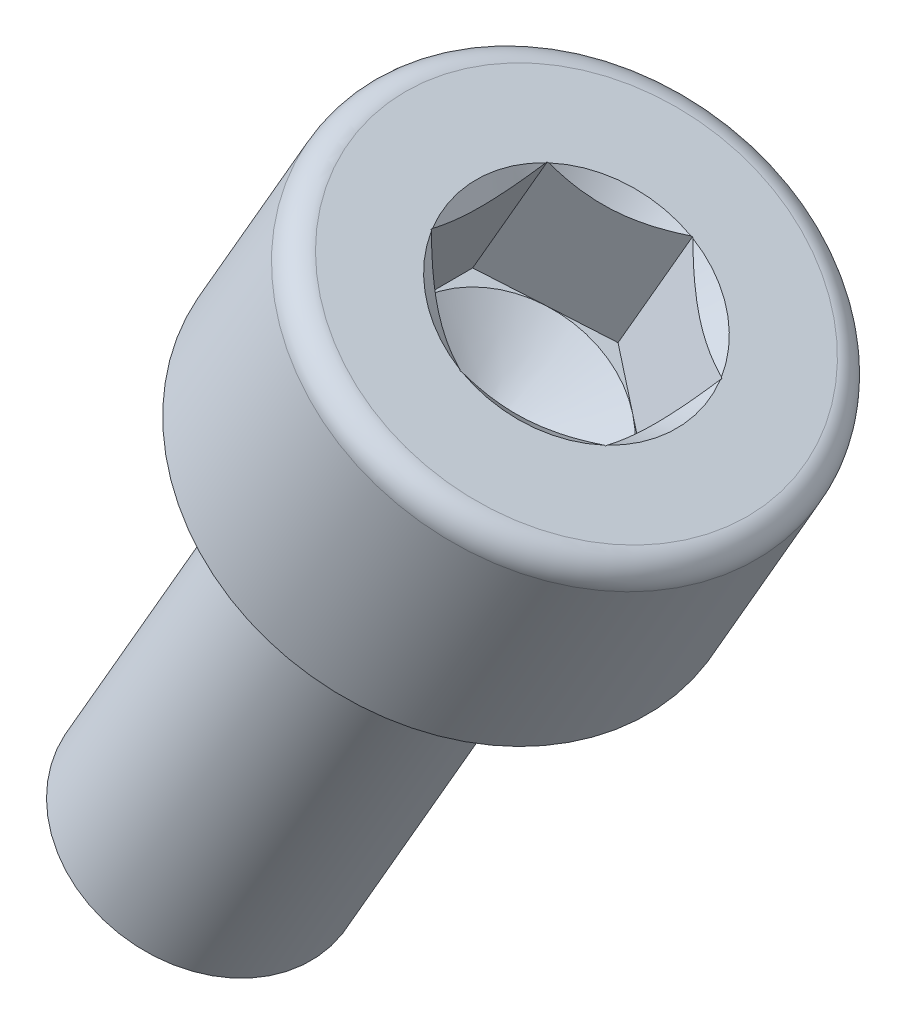
ISO-10303-21;
HEADER;
FILE_DESCRIPTION(('STEP AP214'),'2;1');
FILE_NAME('part.step','',(''),(''),'','','');
FILE_SCHEMA(('AUTOMOTIVE_DESIGN { 1 0 10303 214 1 1 1 1 }'));
ENDSEC;
DATA;
#1=APPLICATION_CONTEXT('core data for automotive mechanical design processes');
#2=APPLICATION_PROTOCOL_DEFINITION('international standard','automotive_design',2000,#1);
#3=PRODUCT_CONTEXT('',#1,'mechanical');
#4=PRODUCT('Part','Part','',(#3));
#5=PRODUCT_RELATED_PRODUCT_CATEGORY('part','',(#4));
#6=PRODUCT_DEFINITION_FORMATION('','',#4);
#7=PRODUCT_DEFINITION_CONTEXT('part definition',#1,'design');
#8=PRODUCT_DEFINITION('design','',#6,#7);
#9=PRODUCT_DEFINITION_SHAPE('','',#8);
#10=(LENGTH_UNIT() NAMED_UNIT(*) SI_UNIT(.MILLI.,.METRE.));
#11=(NAMED_UNIT(*) PLANE_ANGLE_UNIT() SI_UNIT($,.RADIAN.));
#12=(NAMED_UNIT(*) SI_UNIT($,.STERADIAN.) SOLID_ANGLE_UNIT());
#13=UNCERTAINTY_MEASURE_WITH_UNIT(LENGTH_MEASURE(1.E-05),#10,'distance_accuracy_value','');
#14=(GEOMETRIC_REPRESENTATION_CONTEXT(3) GLOBAL_UNCERTAINTY_ASSIGNED_CONTEXT((#13)) GLOBAL_UNIT_ASSIGNED_CONTEXT((#10,
#11,#12)) REPRESENTATION_CONTEXT('',''));
#15=CARTESIAN_POINT('',(0.,0.,0.));
#16=DIRECTION('',(0.,0.,1.));
#17=DIRECTION('',(1.,0.,0.));
#18=AXIS2_PLACEMENT_3D('',#15,#16,#17);
#19=CARTESIAN_POINT('',(231.177788229062,548.1284435325,-362.357299098567));
#20=DIRECTION('',(-0.499999999999997,-0.86602540378444,0.));
#21=DIRECTION('',(0.86602540378444,-0.499999999999997,0.));
#22=AXIS2_PLACEMENT_3D('',#19,#20,#21);
#23=PLANE('',#22);
#24=DIRECTION('',(0.00124392228936698,-0.000718178868616994,0.999998968437693));
#25=VECTOR('',#24,1.);
#26=CARTESIAN_POINT('',(232.259421143508,547.50396247818,-363.08078163776));
#27=LINE('',#26,#25);
#28=CARTESIAN_POINT('',(232.260318867083,547.50344417767,-362.359094545738));
#29=VERTEX_POINT('',#28);
#30=CARTESIAN_POINT('',(232.259421143508,547.50396247818,-363.080781637759));
#31=VERTEX_POINT('',#30);
#32=EDGE_CURVE('E164',#29,#31,#27,.F.);
#33=ORIENTED_EDGE('',*,*,#32,.T.);
#34=DIRECTION('',(-0.750621187472909,0.433371344647004,-0.498755561929496));
#35=VECTOR('',#34,1.);
#36=CARTESIAN_POINT('',(232.259421143508,547.50396247818,-363.080781637759));
#37=LINE('',#36,#35);
#38=CARTESIAN_POINT('',(231.717706962789,547.81672130668,-363.440727459984));
#39=VERTEX_POINT('',#38);
#40=EDGE_CURVE('E160',#31,#39,#37,.T.);
#41=ORIENTED_EDGE('',*,*,#40,.T.);
#42=CARTESIAN_POINT('',(231.177788229441,548.128443533157,-362.357299098567));
#43=DIRECTION('',(0.499999999999986,0.866025403784447,-2.2118650781384E-13));
#44=DIRECTION('',(-0.866025403784447,0.499999999999986,0.));
#45=AXIS2_PLACEMENT_3D('',#42,#43,#44);
#46=CIRCLE('',#45,1.24999999953742);
#47=EDGE_CURVE('E161',#39,#29,#46,.F.);
#48=ORIENTED_EDGE('',*,*,#47,.T.);
#49=EDGE_LOOP('',(#33,#41,#48));
#50=FACE_BOUND('',#49,.T.);
#51=ADVANCED_FACE('F17',(#50),#23,.F.);
#52=CARTESIAN_POINT('',(231.177788229062,548.1284435325,-362.357299098567));
#53=DIRECTION('',(-0.499999999999997,-0.86602540378444,0.));
#54=DIRECTION('',(0.86602540378444,-0.499999999999997,0.));
#55=AXIS2_PLACEMENT_3D('',#52,#53,#54);
#56=PLANE('',#55);
#57=DIRECTION('',(0.749377265183501,-0.432653165778477,-0.501243406508214));
#58=VECTOR('',#57,1.);
#59=CARTESIAN_POINT('',(231.720400133456,547.815166403432,-361.275666184121));
#60=LINE('',#59,#58);
#61=CARTESIAN_POINT('',(231.720400133545,547.815166403819,-361.275666184321));
#62=VERTEX_POINT('',#61);
#63=CARTESIAN_POINT('',(232.261216590679,547.502925876272,-361.637407453717));
#64=VERTEX_POINT('',#63);
#65=EDGE_CURVE('E524',#62,#64,#60,.T.);
#66=ORIENTED_EDGE('',*,*,#65,.T.);
#67=DIRECTION('',(0.00124392228936698,-0.000718178868616994,0.999998968437693));
#68=VECTOR('',#67,1.);
#69=CARTESIAN_POINT('',(232.259421143508,547.50396247818,-363.08078163776));
#70=LINE('',#69,#68);
#71=EDGE_CURVE('E552',#64,#29,#70,.F.);
#72=ORIENTED_EDGE('',*,*,#71,.T.);
#73=CARTESIAN_POINT('',(231.177788229441,548.128443533157,-362.357299098567));
#74=DIRECTION('',(0.499999999999986,0.866025403784447,-2.2118650781384E-13));
#75=DIRECTION('',(-0.866025403784447,0.499999999999986,0.));
#76=AXIS2_PLACEMENT_3D('',#73,#74,#75);
#77=CIRCLE('',#76,1.24999999953749);
#78=EDGE_CURVE('E179',#62,#29,#77,.T.);
#79=ORIENTED_EDGE('',*,*,#78,.F.);
#80=EDGE_LOOP('',(#66,#72,#79));
#81=FACE_BOUND('',#80,.T.);
#82=ADVANCED_FACE('F756',(#81),#56,.F.);
#83=CARTESIAN_POINT('',(232.259421143508,547.50396247818,-363.08078163776));
#84=DIRECTION('',(0.866024510425278,-0.499999484218843,-0.001436357737234));
#85=DIRECTION('',(0.499999999999996,0.866025403784441,0.));
#86=AXIS2_PLACEMENT_3D('',#83,#84,#85);
#87=PLANE('',#86);
#88=DIRECTION('',(0.00124392228936698,-0.000718178868616994,0.999998968437693));
#89=VECTOR('',#88,1.);
#90=CARTESIAN_POINT('',(233.184421143508,549.106109475181,-363.08078163776));
#91=LINE('',#90,#89);
#92=CARTESIAN_POINT('',(233.184421143508,549.106109475181,-363.080781637759));
#93=VERTEX_POINT('',#92);
#94=CARTESIAN_POINT('',(233.184442166602,549.106097337533,-363.063881020436));
#95=VERTEX_POINT('',#94);
#96=EDGE_CURVE('E428',#93,#95,#91,.T.);
#97=ORIENTED_EDGE('',*,*,#96,.F.);
#98=DIRECTION('',(-0.500000000000029,-0.866025403784422,0.));
#99=VECTOR('',#98,1.);
#100=CARTESIAN_POINT('',(233.184421143508,549.106109475181,-363.080781637759));
#101=LINE('',#100,#99);
#102=EDGE_CURVE('E169',#93,#31,#101,.T.);
#103=ORIENTED_EDGE('',*,*,#102,.T.);
#104=ORIENTED_EDGE('',*,*,#32,.F.);
#105=ORIENTED_EDGE('',*,*,#71,.F.);
#106=DIRECTION('',(0.500000000000051,0.866025403784409,0.));
#107=VECTOR('',#106,1.);
#108=CARTESIAN_POINT('',(232.261216590679,547.502925876272,-361.637407453717));
#109=LINE('',#108,#107);
#110=CARTESIAN_POINT('',(233.186216590679,549.105072873273,-361.637407453717));
#111=VERTEX_POINT('',#110);
#112=EDGE_CURVE('E514',#64,#111,#109,.T.);
#113=ORIENTED_EDGE('',*,*,#112,.T.);
#114=DIRECTION('',(0.00124392228936698,-0.000718178868616994,0.999998968437693));
#115=VECTOR('',#114,1.);
#116=CARTESIAN_POINT('',(233.184421143508,549.106109475181,-363.08078163776));
#117=LINE('',#116,#115);
#118=CARTESIAN_POINT('',(233.186195567648,549.105085011029,-361.654308070932));
#119=VERTEX_POINT('',#118);
#120=EDGE_CURVE('E182',#119,#111,#117,.T.);
#121=ORIENTED_EDGE('',*,*,#120,.F.);
#122=CARTESIAN_POINT('',(233.184442166648,549.10609733758,-363.063881020586));
#123=CARTESIAN_POINT('',(233.172644884747,549.085525026057,-363.015557488961));
#124=CARTESIAN_POINT('',(233.161560640962,549.066185453478,-362.966440531832));
#125=CARTESIAN_POINT('',(233.141292004143,549.030791535469,-362.866323081709));
#126=CARTESIAN_POINT('',(233.132119481784,549.014757723132,-362.815313009606));
#127=CARTESIAN_POINT('',(233.116333507926,548.987118516482,-362.711892543585));
#128=CARTESIAN_POINT('',(233.109710481527,548.975496555323,-362.659488195184));
#129=CARTESIAN_POINT('',(233.099567079166,548.957623427783,-362.553581787685));
#130=CARTESIAN_POINT('',(233.096037607527,548.951356517841,-362.50008342311));
#131=CARTESIAN_POINT('',(233.093743757376,548.947187440853,-362.431851194315));
#132=CARTESIAN_POINT('',(233.093381505867,548.946518221717,-362.417307089604));
#133=CARTESIAN_POINT('',(233.092909945372,548.945617860091,-362.388207513258));
#134=CARTESIAN_POINT('',(233.092800521647,548.945386518892,-362.373652049778));
#135=CARTESIAN_POINT('',(233.09286667599,548.945350297496,-362.321156797242));
#136=CARTESIAN_POINT('',(233.093782235586,548.946827068951,-362.283205190168));
#137=CARTESIAN_POINT('',(233.097298138949,548.952699594373,-362.207598115745));
#138=CARTESIAN_POINT('',(233.099899670433,548.957097406181,-362.16994287612));
#139=CARTESIAN_POINT('',(233.110071767781,548.974392964188,-362.057494884762));
#140=CARTESIAN_POINT('',(233.120007848879,548.991390253783,-361.983520459256));
#141=CARTESIAN_POINT('',(233.139785554404,549.025311610405,-361.867033511053));
#142=CARTESIAN_POINT('',(233.1481662412,549.039702200408,-361.823456205357));
#143=CARTESIAN_POINT('',(233.166261186764,549.070797644643,-361.737850585768));
#144=CARTESIAN_POINT('',(233.175963381897,549.087481575075,-361.695812187019));
#145=CARTESIAN_POINT('',(233.186195567657,549.105085011045,-361.654308070895));
#146=B_SPLINE_CURVE_WITH_KNOTS('',3,(#122,#123,#124,#125,#126,#127,#128,#129,#130,#131,#132,
#133,#134,#135,#136,#137,#138,#139,#140,#141,#142,#143,#144,#145),.UNSPECIFIED.,.F.,.F.,(4,2,2,
2,2,2,2,2,2,2,2,4),(0.,0.161592976152803,0.324161275089221,0.486112932364473,0.64758680606129,
0.691272786490334,0.734938937503871,0.848735605559947,0.962612527237212,1.19125625178,
1.3311331060686,1.46980937850131),.UNSPECIFIED.);
#147=EDGE_CURVE('E423',#95,#119,#146,.T.);
#148=ORIENTED_EDGE('',*,*,#147,.F.);
#149=EDGE_LOOP('',(#97,#103,#104,#105,#113,#121,#148));
#150=FACE_BOUND('',#149,.T.);
#151=ADVANCED_FACE('F414',(#150),#87,.F.);
#152=CARTESIAN_POINT('',(231.17599278189,548.129480134408,-363.800673282609));
#153=DIRECTION('',(0.431934986909713,-0.249377780964739,-0.866742689293892));
#154=DIRECTION('',(-0.895019691172818,0.,-0.446026627470731));
#155=AXIS2_PLACEMENT_3D('',#152,#153,#154);
#156=PLANE('',#155);
#157=DIRECTION('',(-0.500000000000051,-0.866025403784409,0.));
#158=VECTOR('',#157,1.);
#159=CARTESIAN_POINT('',(232.10099278189,549.731627131409,-363.800673282609));
#160=LINE('',#159,#158);
#161=CARTESIAN_POINT('',(232.10099278189,549.731627131409,-363.800673282609));
#162=VERTEX_POINT('',#161);
#163=CARTESIAN_POINT('',(231.17599278189,548.129480134408,-363.800673282609));
#164=VERTEX_POINT('',#163);
#165=EDGE_CURVE('E174',#162,#164,#160,.T.);
#166=ORIENTED_EDGE('',*,*,#165,.T.);
#167=DIRECTION('',(0.750621187472946,-0.433371344646999,0.498755561929445));
#168=VECTOR('',#167,1.);
#169=CARTESIAN_POINT('',(231.17599278189,548.129480134408,-363.800673282609));
#170=LINE('',#169,#168);
#171=EDGE_CURVE('E148',#164,#39,#170,.T.);
#172=ORIENTED_EDGE('',*,*,#171,.T.);
#173=ORIENTED_EDGE('',*,*,#40,.F.);
#174=ORIENTED_EDGE('',*,*,#102,.F.);
#175=DIRECTION('',(0.750621187470166,-0.433371344652309,0.498755561929014));
#176=VECTOR('',#175,1.);
#177=CARTESIAN_POINT('',(233.171735169125,549.113433725906,-363.089210923246));
#178=LINE('',#177,#176);
#179=CARTESIAN_POINT('',(233.171735169102,549.113433726019,-363.08921092329));
#180=VERTEX_POINT('',#179);
#181=EDGE_CURVE('E422',#180,#93,#178,.T.);
#182=ORIENTED_EDGE('',*,*,#181,.F.);
#183=CARTESIAN_POINT('',(232.113678756365,549.724302880745,-363.792243997113));
#184=CARTESIAN_POINT('',(232.138094067797,549.682823218711,-363.768142342071));
#185=CARTESIAN_POINT('',(232.163816992992,549.642233017214,-363.743644961242));
#186=CARTESIAN_POINT('',(232.218574174539,549.563522922774,-363.693710774633));
#187=CARTESIAN_POINT('',(232.247627479942,549.525419418489,-363.668269191213));
#188=CARTESIAN_POINT('',(232.309342532022,549.453034973651,-363.61668760536));
#189=CARTESIAN_POINT('',(232.341990173421,549.418740081867,-363.590550618164));
#190=CARTESIAN_POINT('',(232.411210706945,549.355046164583,-363.53772915389));
#191=CARTESIAN_POINT('',(232.447771734797,549.325632993969,-363.511046519477));
#192=CARTESIAN_POINT('',(232.496609618404,549.29194299673,-363.477015280763));
#193=CARTESIAN_POINT('',(232.507146399551,549.284981218155,-363.469761320164));
#194=CARTESIAN_POINT('',(232.528481422489,549.271490819715,-363.455247729635));
#195=CARTESIAN_POINT('',(232.539279543431,549.264962004671,-363.447988103773));
#196=CARTESIAN_POINT('',(232.578684487133,549.242213522655,-363.421805777576));
#197=CARTESIAN_POINT('',(232.608040147589,549.227270394214,-363.402877182951));
#198=CARTESIAN_POINT('',(232.668214332061,549.200431245781,-363.365167695172));
#199=CARTESIAN_POINT('',(232.699033873143,549.188537382154,-363.346386915597));
#200=CARTESIAN_POINT('',(232.793472025654,549.157181910532,-363.290302796619));
#201=CARTESIAN_POINT('',(232.858842916616,549.142173897727,-363.253407602401));
#202=CARTESIAN_POINT('',(232.965913382862,549.125696755447,-363.195309029162));
#203=CARTESIAN_POINT('',(233.006949945511,549.121233466736,-363.173574583152));
#204=CARTESIAN_POINT('',(233.089195862343,549.115291330441,-363.130878260205));
#205=CARTESIAN_POINT('',(233.130400710261,549.113787195809,-363.109911353385));
#206=CARTESIAN_POINT('',(233.171735169141,549.113433726021,-363.089210923271));
#207=B_SPLINE_CURVE_WITH_KNOTS('',3,(#183,#184,#185,#186,#187,#188,#189,#190,#191,#192,#193,
#194,#195,#196,#197,#198,#199,#200,#201,#202,#203,#204,#205,#206),.UNSPECIFIED.,.F.,.F.,(4,2,2,
2,2,2,2,2,2,2,2,4),(0.,0.161592976156838,0.324161275095929,0.486112932367295,0.64758680606111,
0.691272786490041,0.734938937503583,0.848735605560681,0.962612527237655,1.19125625177881,
1.33113310606732,1.4698093785017),.UNSPECIFIED.);
#208=CARTESIAN_POINT('',(232.113678756437,549.72430288063,-363.792243997024));
#209=VERTEX_POINT('',#208);
#210=EDGE_CURVE('E417',#209,#180,#207,.T.);
#211=ORIENTED_EDGE('',*,*,#210,.F.);
#212=DIRECTION('',(0.750621187474568,-0.433371344642524,0.498755561930892));
#213=VECTOR('',#212,1.);
#214=CARTESIAN_POINT('',(232.10099278189,549.731627131409,-363.800673282609));
#215=LINE('',#214,#213);
#216=EDGE_CURVE('E168',#162,#209,#215,.T.);
#217=ORIENTED_EDGE('',*,*,#216,.F.);
#218=EDGE_LOOP('',(#166,#172,#173,#174,#182,#211,#217));
#219=FACE_BOUND('',#218,.T.);
#220=ADVANCED_FACE('F171',(#219),#156,.F.);
#221=CARTESIAN_POINT('',(231.177788229062,548.1284435325,-362.357299098567));
#222=DIRECTION('',(-0.499999999999997,-0.86602540378444,0.));
#223=DIRECTION('',(0.86602540378444,-0.499999999999997,0.));
#224=AXIS2_PLACEMENT_3D('',#221,#222,#223);
#225=PLANE('',#224);
#226=ORIENTED_EDGE('',*,*,#171,.F.);
#227=DIRECTION('',(-0.749377265183696,0.432653165778134,0.501243406508218));
#228=VECTOR('',#227,1.);
#229=CARTESIAN_POINT('',(231.17599278189,548.129480134408,-363.800673282609));
#230=LINE('',#229,#228);
#231=CARTESIAN_POINT('',(230.635176324958,548.441720661838,-363.438932012813));
#232=VERTEX_POINT('',#231);
#233=EDGE_CURVE('E150',#164,#232,#230,.T.);
#234=ORIENTED_EDGE('',*,*,#233,.T.);
#235=CARTESIAN_POINT('',(231.177788229441,548.128443533157,-362.357299098567));
#236=DIRECTION('',(0.499999999999986,0.866025403784447,-2.2118650781384E-13));
#237=DIRECTION('',(-0.866025403784447,0.499999999999986,0.));
#238=AXIS2_PLACEMENT_3D('',#235,#236,#237);
#239=CIRCLE('',#238,1.24999999953734);
#240=EDGE_CURVE('E144',#232,#39,#239,.F.);
#241=ORIENTED_EDGE('',*,*,#240,.T.);
#242=EDGE_LOOP('',(#226,#234,#241));
#243=FACE_BOUND('',#242,.T.);
#244=ADVANCED_FACE('F146',(#243),#225,.F.);
#245=CARTESIAN_POINT('',(231.177788229408,548.1284435331,-362.357299098567));
#246=DIRECTION('',(0.499999999999986,0.866025403784447,-2.2118650781384E-13));
#247=DIRECTION('',(-0.866025403784447,0.499999999999986,0.));
#248=AXIS2_PLACEMENT_3D('',#245,#246,#247);
#249=CONICAL_SURFACE('',#248,1.24999999942379,1.04719754990414);
#250=CARTESIAN_POINT('',(231.177788229441,548.128443533157,-362.357299098567));
#251=DIRECTION('',(0.499999999999986,0.866025403784447,-2.2118650781384E-13));
#252=DIRECTION('',(-0.866025403784447,0.499999999999986,0.));
#253=AXIS2_PLACEMENT_3D('',#250,#251,#252);
#254=CIRCLE('',#253,1.24999999953747);
#255=CARTESIAN_POINT('',(230.637869495715,548.440165758977,-361.27387073715));
#256=VERTEX_POINT('',#255);
#257=EDGE_CURVE('E155',#256,#62,#254,.T.);
#258=ORIENTED_EDGE('',*,*,#257,.T.);
#259=ORIENTED_EDGE('',*,*,#78,.T.);
#260=ORIENTED_EDGE('',*,*,#47,.F.);
#261=ORIENTED_EDGE('',*,*,#240,.F.);
#262=CARTESIAN_POINT('',(231.177788229441,548.128443533157,-362.357299098567));
#263=DIRECTION('',(0.499999999999986,0.866025403784447,-2.2118650781384E-13));
#264=DIRECTION('',(-0.866025403784447,0.499999999999986,0.));
#265=AXIS2_PLACEMENT_3D('',#262,#263,#264);
#266=CIRCLE('',#265,1.24999999953734);
#267=CARTESIAN_POINT('',(230.09525759142,548.753442887986,-362.355503651395));
#268=VERTEX_POINT('',#267);
#269=EDGE_CURVE('E382',#232,#268,#266,.T.);
#270=ORIENTED_EDGE('',*,*,#269,.T.);
#271=CARTESIAN_POINT('',(231.177788229441,548.128443533157,-362.357299098567));
#272=DIRECTION('',(0.499999999999986,0.866025403784447,-2.2118650781384E-13));
#273=DIRECTION('',(-0.866025403784447,0.499999999999986,0.));
#274=AXIS2_PLACEMENT_3D('',#271,#272,#273);
#275=CIRCLE('',#274,1.24999999953743);
#276=EDGE_CURVE('E793',#268,#256,#275,.T.);
#277=ORIENTED_EDGE('',*,*,#276,.T.);
#278=EDGE_LOOP('',(#258,#259,#260,#261,#270,#277));
#279=FACE_BOUND('',#278,.T.);
#280=CARTESIAN_POINT('',(230.816944310303,547.503443531604,-362.357299098595));
#281=VERTEX_POINT('',#280);
#282=VERTEX_LOOP('',#281);
#283=FACE_BOUND('',#282,.T.);
#284=ADVANCED_FACE('F176',(#279,#283),#249,.F.);
#285=CARTESIAN_POINT('',(231.177788229062,548.1284435325,-362.357299098567));
#286=DIRECTION('',(-0.499999999999997,-0.86602540378444,0.));
#287=DIRECTION('',(0.86602540378444,-0.499999999999997,0.));
#288=AXIS2_PLACEMENT_3D('',#285,#286,#287);
#289=PLANE('',#288);
#290=DIRECTION('',(0.750621187472557,-0.43337134464762,0.49875556192949));
#291=VECTOR('',#290,1.);
#292=CARTESIAN_POINT('',(230.637869495425,548.440165758706,-361.273870736949));
#293=LINE('',#292,#291);
#294=CARTESIAN_POINT('',(231.179583676233,548.127406930592,-360.913924914525));
#295=VERTEX_POINT('',#294);
#296=EDGE_CURVE('E509',#256,#295,#293,.T.);
#297=ORIENTED_EDGE('',*,*,#296,.T.);
#298=DIRECTION('',(0.749377265183496,-0.432653165778519,-0.501243406508185));
#299=VECTOR('',#298,1.);
#300=CARTESIAN_POINT('',(231.179583676233,548.127406930592,-360.913924914524));
#301=LINE('',#300,#299);
#302=EDGE_CURVE('E519',#295,#62,#301,.T.);
#303=ORIENTED_EDGE('',*,*,#302,.T.);
#304=ORIENTED_EDGE('',*,*,#257,.F.);
#305=EDGE_LOOP('',(#297,#303,#304));
#306=FACE_BOUND('',#305,.T.);
#307=ADVANCED_FACE('F402',(#306),#289,.F.);
#308=CARTESIAN_POINT('',(232.261216590679,547.502925876272,-361.637407453717));
#309=DIRECTION('',(0.434089523515564,-0.250621703254105,0.865306331556659));
#310=DIRECTION('',(0.893832919324574,0.,-0.448400169861376));
#311=AXIS2_PLACEMENT_3D('',#308,#309,#310);
#312=PLANE('',#311);
#313=ORIENTED_EDGE('',*,*,#112,.F.);
#314=ORIENTED_EDGE('',*,*,#65,.F.);
#315=ORIENTED_EDGE('',*,*,#302,.F.);
#316=DIRECTION('',(0.50000000000004,0.866025403784416,0.));
#317=VECTOR('',#316,1.);
#318=CARTESIAN_POINT('',(231.179583676233,548.127406930592,-360.913924914525));
#319=LINE('',#318,#317);
#320=CARTESIAN_POINT('',(232.104583676233,549.729553927593,-360.913924914525));
#321=VERTEX_POINT('',#320);
#322=EDGE_CURVE('E505',#295,#321,#319,.T.);
#323=ORIENTED_EDGE('',*,*,#322,.T.);
#324=DIRECTION('',(-0.749377265193565,0.43265316576259,0.501243406506881));
#325=VECTOR('',#324,1.);
#326=CARTESIAN_POINT('',(232.11724862754,549.722241814547,-360.922396246164));
#327=LINE('',#326,#325);
#328=CARTESIAN_POINT('',(232.117248627633,549.722241814596,-360.922396246208));
#329=VERTEX_POINT('',#328);
#330=EDGE_CURVE('E517',#329,#321,#327,.T.);
#331=ORIENTED_EDGE('',*,*,#330,.F.);
#332=CARTESIAN_POINT('',(233.173551639394,549.112384986422,-361.628936122039));
#333=CARTESIAN_POINT('',(233.125481653387,549.112754730377,-361.604714245456));
#334=CARTESIAN_POINT('',(233.077529142885,549.114701061512,-361.580094669153));
#335=CARTESIAN_POINT('',(232.982110149246,549.122695222242,-361.529911405638));
#336=CARTESIAN_POINT('',(232.934648346492,549.128767736248,-361.504342916954));
#337=CARTESIAN_POINT('',(232.841232699542,549.145948042256,-361.452504036787));
#338=CARTESIAN_POINT('',(232.795273818342,549.157036647455,-361.426236675582));
#339=CARTESIAN_POINT('',(232.705634740619,549.185060369486,-361.373151732359));
#340=CARTESIAN_POINT('',(232.66194822161,549.201978141655,-361.346336002197));
#341=CARTESIAN_POINT('',(232.608437762026,549.227378987908,-361.312135012118));
#342=CARTESIAN_POINT('',(232.597158386108,549.233012773487,-361.304844868007));
#343=CARTESIAN_POINT('',(232.574844044527,549.244723347403,-361.29025888219));
#344=CARTESIAN_POINT('',(232.563808970249,549.250799933496,-361.282963044572));
#345=CARTESIAN_POINT('',(232.524471035146,549.273513673755,-361.256650118232));
#346=CARTESIAN_POINT('',(232.496899284989,549.291437601156,-361.237627105782));
#347=CARTESIAN_POINT('',(232.443662857826,549.330076099879,-361.199729519138));
#348=CARTESIAN_POINT('',(232.417999539472,549.350792630352,-361.180855059089));
#349=CARTESIAN_POINT('',(232.343765704946,549.41681997585,-361.124491186708));
#350=CARTESIAN_POINT('',(232.29817495765,549.465875694764,-361.087411955421));
#351=CARTESIAN_POINT('',(232.230515001593,549.550279208836,-361.029023580458));
#352=CARTESIAN_POINT('',(232.206185605698,549.583554973886,-361.007180720772));
#353=CARTESIAN_POINT('',(232.160023093145,549.651749478862,-360.96427142413));
#354=CARTESIAN_POINT('',(232.13817034294,549.686651665481,-360.9431999322));
#355=CARTESIAN_POINT('',(232.117248627632,549.722241814618,-360.922396246189));
#356=B_SPLINE_CURVE_WITH_KNOTS('',3,(#332,#333,#334,#335,#336,#337,#338,#339,#340,#341,#342,
#343,#344,#345,#346,#347,#348,#349,#350,#351,#352,#353,#354,#355),.UNSPECIFIED.,.F.,.F.,(4,2,2,
2,2,2,2,2,2,2,2,4),(0.,0.161592976156798,0.324161275095758,0.486112932367122,0.647586806060747,
0.691272786489624,0.734938937503271,0.848735605560365,0.96261252723748,1.19125625177868,
1.33113310606679,1.46980937850078),.UNSPECIFIED.);
#357=CARTESIAN_POINT('',(233.173551639272,549.112384986378,-361.628936122011));
#358=VERTEX_POINT('',#357);
#359=EDGE_CURVE('E383',#358,#329,#356,.T.);
#360=ORIENTED_EDGE('',*,*,#359,.F.);
#361=DIRECTION('',(-0.749377265154543,0.432653165828576,0.501243406508264));
#362=VECTOR('',#361,1.);
#363=CARTESIAN_POINT('',(233.186216590679,549.105072873273,-361.637407453717));
#364=LINE('',#363,#362);
#365=EDGE_CURVE('E381',#111,#358,#364,.T.);
#366=ORIENTED_EDGE('',*,*,#365,.F.);
#367=EDGE_LOOP('',(#313,#314,#315,#323,#331,#360,#366));
#368=FACE_BOUND('',#367,.T.);
#369=ADVANCED_FACE('F396',(#368),#312,.F.);
#370=CARTESIAN_POINT('',(230.094359867445,548.753961188727,-363.077190743417));
#371=DIRECTION('',(-0.434089523515564,0.250621703254105,-0.865306331556659));
#372=DIRECTION('',(-0.893832919324574,0.,0.448400169861376));
#373=AXIS2_PLACEMENT_3D('',#370,#371,#372);
#374=PLANE('',#373);
#375=DIRECTION('',(-0.499999999999996,-0.866025403784441,0.));
#376=VECTOR('',#375,1.);
#377=CARTESIAN_POINT('',(230.094359867444,548.753961188727,-363.077190743417));
#378=LINE('',#377,#376);
#379=CARTESIAN_POINT('',(231.019359867444,550.356108185728,-363.077190743417));
#380=VERTEX_POINT('',#379);
#381=CARTESIAN_POINT('',(230.094359867445,548.753961188727,-363.077190743417));
#382=VERTEX_POINT('',#381);
#383=EDGE_CURVE('E802',#380,#382,#378,.T.);
#384=ORIENTED_EDGE('',*,*,#383,.T.);
#385=DIRECTION('',(0.749377265183792,-0.43265316577849,-0.501243406507767));
#386=VECTOR('',#385,1.);
#387=CARTESIAN_POINT('',(230.094359867445,548.753961188727,-363.077190743417));
#388=LINE('',#387,#386);
#389=EDGE_CURVE('E823',#382,#232,#388,.T.);
#390=ORIENTED_EDGE('',*,*,#389,.T.);
#391=ORIENTED_EDGE('',*,*,#233,.F.);
#392=ORIENTED_EDGE('',*,*,#165,.F.);
#393=DIRECTION('',(0.749377265177957,-0.432653165787645,-0.50124340650859));
#394=VECTOR('',#393,1.);
#395=CARTESIAN_POINT('',(232.088327830584,549.738939244455,-363.79220195097));
#396=LINE('',#395,#394);
#397=CARTESIAN_POINT('',(232.088327830544,549.73893924458,-363.792201950926));
#398=VERTEX_POINT('',#397);
#399=EDGE_CURVE('E380',#398,#162,#396,.T.);
#400=ORIENTED_EDGE('',*,*,#399,.F.);
#401=CARTESIAN_POINT('',(231.032024818829,550.348796072752,-363.085662075095));
#402=CARTESIAN_POINT('',(231.056380019491,550.307351115688,-363.109883951678));
#403=CARTESIAN_POINT('',(231.082041846948,550.266796188985,-363.134503527981));
#404=CARTESIAN_POINT('',(231.136674490042,550.188157996855,-363.184686791496));
#405=CARTESIAN_POINT('',(231.165664342813,550.150091126964,-363.21025528018));
#406=CARTESIAN_POINT('',(231.227250747736,550.077780956597,-363.262094160347));
#407=CARTESIAN_POINT('',(231.259833202131,550.043523700548,-363.288361521552));
#408=CARTESIAN_POINT('',(231.32892199618,549.979905843085,-363.341446464775));
#409=CARTESIAN_POINT('',(231.365416476158,549.950531093904,-363.368262194937));
#410=CARTESIAN_POINT('',(231.414169484082,549.916890099663,-363.402463185016));
#411=CARTESIAN_POINT('',(231.424688173473,549.909938766368,-363.409753329127));
#412=CARTESIAN_POINT('',(231.445986998767,549.896469266649,-363.424339314944));
#413=CARTESIAN_POINT('',(231.456767013831,549.889950905038,-363.431635152562));
#414=CARTESIAN_POINT('',(231.496106657461,549.867240124035,-363.457948078902));
#415=CARTESIAN_POINT('',(231.525415109004,549.852324251673,-363.476971091352));
#416=CARTESIAN_POINT('',(231.585495244044,549.825539402705,-363.514868677996));
#417=CARTESIAN_POINT('',(231.616267944889,549.813672582301,-363.533743138045));
#418=CARTESIAN_POINT('',(231.710566220698,549.782397868531,-363.590107010426));
#419=CARTESIAN_POINT('',(231.775845093126,549.767442982652,-363.627186241713));
#420=CARTESIAN_POINT('',(231.88277065851,549.751049498923,-363.685574616676));
#421=CARTESIAN_POINT('',(231.923753014322,549.746617506544,-363.707417476362));
#422=CARTESIAN_POINT('',(232.005892444306,549.740736850459,-363.750326773004));
#423=CARTESIAN_POINT('',(232.047044999669,549.739262906948,-363.771398264934));
#424=CARTESIAN_POINT('',(232.0883278306,549.73893924457,-363.792201950945));
#425=B_SPLINE_CURVE_WITH_KNOTS('',3,(#401,#402,#403,#404,#405,#406,#407,#408,#409,#410,#411,
#412,#413,#414,#415,#416,#417,#418,#419,#420,#421,#422,#423,#424),.UNSPECIFIED.,.F.,.F.,(4,2,2,
2,2,2,2,2,2,2,2,4),(0.,0.161592976156892,0.324161275095849,0.486112932367277,0.647586806061016,
0.691272786489565,0.73493893750287,0.848735605559928,0.962612527236987,1.19125625177819,
1.33113310606675,1.46980937850102),.UNSPECIFIED.);
#426=CARTESIAN_POINT('',(231.032024818852,550.348796072624,-363.085662075123));
#427=VERTEX_POINT('',#426);
#428=EDGE_CURVE('E372',#427,#398,#425,.T.);
#429=ORIENTED_EDGE('',*,*,#428,.F.);
#430=DIRECTION('',(0.749377265196929,-0.432653165757963,-0.501243406505846));
#431=VECTOR('',#430,1.);
#432=CARTESIAN_POINT('',(231.019359867444,550.356108185728,-363.077190743417));
#433=LINE('',#432,#431);
#434=EDGE_CURVE('E496',#380,#427,#433,.T.);
#435=ORIENTED_EDGE('',*,*,#434,.F.);
#436=EDGE_LOOP('',(#384,#390,#391,#392,#400,#429,#435));
#437=FACE_BOUND('',#436,.T.);
#438=ADVANCED_FACE('F391',(#437),#374,.F.);
#439=CARTESIAN_POINT('',(231.177788229062,548.1284435325,-362.357299098567));
#440=DIRECTION('',(-0.499999999999997,-0.86602540378444,0.));
#441=DIRECTION('',(0.86602540378444,-0.499999999999997,0.));
#442=AXIS2_PLACEMENT_3D('',#439,#440,#441);
#443=PLANE('',#442);
#444=ORIENTED_EDGE('',*,*,#389,.F.);
#445=DIRECTION('',(0.00124392228936698,-0.000718178868616994,0.999998968437693));
#446=VECTOR('',#445,1.);
#447=CARTESIAN_POINT('',(230.096155314616,548.752924586819,-361.633816559374));
#448=LINE('',#447,#446);
#449=EDGE_CURVE('E816',#382,#268,#448,.T.);
#450=ORIENTED_EDGE('',*,*,#449,.T.);
#451=ORIENTED_EDGE('',*,*,#269,.F.);
#452=EDGE_LOOP('',(#444,#450,#451));
#453=FACE_BOUND('',#452,.T.);
#454=ADVANCED_FACE('F395',(#453),#443,.F.);
#455=CARTESIAN_POINT('',(231.177788229062,548.1284435325,-362.357299098567));
#456=DIRECTION('',(-0.499999999999997,-0.86602540378444,0.));
#457=DIRECTION('',(0.86602540378444,-0.499999999999997,0.));
#458=AXIS2_PLACEMENT_3D('',#455,#456,#457);
#459=PLANE('',#458);
#460=DIRECTION('',(0.00124392228936698,-0.000718178868616994,0.999998968437693));
#461=VECTOR('',#460,1.);
#462=CARTESIAN_POINT('',(230.096155314616,548.752924586819,-361.633816559374));
#463=LINE('',#462,#461);
#464=CARTESIAN_POINT('',(230.096155314616,548.752924586819,-361.633816559374));
#465=VERTEX_POINT('',#464);
#466=EDGE_CURVE('E339',#268,#465,#463,.T.);
#467=ORIENTED_EDGE('',*,*,#466,.T.);
#468=DIRECTION('',(0.750621187473495,-0.433371344646041,0.498755561929451));
#469=VECTOR('',#468,1.);
#470=CARTESIAN_POINT('',(230.096155314616,548.752924586819,-361.633816559374));
#471=LINE('',#470,#469);
#472=EDGE_CURVE('E528',#465,#256,#471,.T.);
#473=ORIENTED_EDGE('',*,*,#472,.T.);
#474=ORIENTED_EDGE('',*,*,#276,.F.);
#475=EDGE_LOOP('',(#467,#473,#474));
#476=FACE_BOUND('',#475,.T.);
#477=ADVANCED_FACE('F704',(#476),#459,.F.);
#478=CARTESIAN_POINT('',(231.179583676233,548.127406930592,-360.913924914525));
#479=DIRECTION('',(-0.431934986909713,0.249377780964739,0.866742689293892));
#480=DIRECTION('',(0.895019691172818,0.,0.446026627470731));
#481=AXIS2_PLACEMENT_3D('',#478,#479,#480);
#482=PLANE('',#481);
#483=ORIENTED_EDGE('',*,*,#322,.F.);
#484=ORIENTED_EDGE('',*,*,#296,.F.);
#485=ORIENTED_EDGE('',*,*,#472,.F.);
#486=DIRECTION('',(-0.499999999999996,-0.866025403784441,0.));
#487=VECTOR('',#486,1.);
#488=CARTESIAN_POINT('',(230.096155314616,548.752924586819,-361.633816559374));
#489=LINE('',#488,#487);
#490=CARTESIAN_POINT('',(231.021155314616,550.355071583821,-361.633816559374));
#491=VERTEX_POINT('',#490);
#492=EDGE_CURVE('E333',#465,#491,#489,.F.);
#493=ORIENTED_EDGE('',*,*,#492,.T.);
#494=DIRECTION('',(-0.750621187457393,0.433371344674192,-0.498755561929224));
#495=VECTOR('',#494,1.);
#496=CARTESIAN_POINT('',(231.033841288998,550.347747333096,-361.625387273887));
#497=LINE('',#496,#495);
#498=CARTESIAN_POINT('',(231.033841289119,550.347747333129,-361.625387273825));
#499=VERTEX_POINT('',#498);
#500=EDGE_CURVE('E808',#499,#491,#497,.T.);
#501=ORIENTED_EDGE('',*,*,#500,.F.);
#502=CARTESIAN_POINT('',(232.091897701857,549.736878178429,-360.922354200021));
#503=CARTESIAN_POINT('',(232.04376760508,549.737282627354,-360.946455855063));
#504=CARTESIAN_POINT('',(231.995753996841,549.739264233284,-360.970953235892));
#505=CARTESIAN_POINT('',(231.900210464748,549.747330296323,-361.020887422501));
#506=CARTESIAN_POINT('',(231.852685209363,549.753439444723,-361.046329005921));
#507=CARTESIAN_POINT('',(231.759140915255,549.770694025201,-361.097910591774));
#508=CARTESIAN_POINT('',(231.71311684705,549.781820266135,-361.124047578969));
#509=CARTESIAN_POINT('',(231.623346029853,549.809920047987,-361.176869043243));
#510=CARTESIAN_POINT('',(231.57959296297,549.826876241589,-361.203551677656));
#511=CARTESIAN_POINT('',(231.525997627704,549.85232609084,-361.237582916371));
#512=CARTESIAN_POINT('',(231.514700160029,549.8579703217,-361.24483687697));
#513=CARTESIAN_POINT('',(231.492349620804,549.869701794335,-361.259350467498));
#514=CARTESIAN_POINT('',(231.481296440649,549.875788833862,-361.26661009336));
#515=CARTESIAN_POINT('',(231.441893205474,549.898540275134,-361.292792419557));
#516=CARTESIAN_POINT('',(231.414274246405,549.916491458613,-361.311721014182));
#517=CARTESIAN_POINT('',(231.36094376981,549.955184256802,-361.349430501961));
#518=CARTESIAN_POINT('',(231.335233611218,549.975927830498,-361.368211281537));
#519=CARTESIAN_POINT('',(231.26085989999,550.042035933848,-361.424295400514));
#520=CARTESIAN_POINT('',(231.21517713416,550.091144779687,-361.461190594732));
#521=CARTESIAN_POINT('',(231.147372277241,550.175631952311,-361.519289167971));
#522=CARTESIAN_POINT('',(231.122988674508,550.208939013694,-361.541023613982));
#523=CARTESIAN_POINT('',(231.076719675108,550.27719499888,-361.583719936929));
#524=CARTESIAN_POINT('',(231.054814632347,550.31212737662,-361.604686843749));
#525=CARTESIAN_POINT('',(231.03384128909,550.347747333167,-361.625387273862));
#526=B_SPLINE_CURVE_WITH_KNOTS('',3,(#502,#503,#504,#505,#506,#507,#508,#509,#510,#511,#512,
#513,#514,#515,#516,#517,#518,#519,#520,#521,#522,#523,#524,#525),.UNSPECIFIED.,.F.,.F.,(4,2,2,
2,2,2,2,2,2,2,2,4),(0.,0.161592976156823,0.324161275095907,0.486112932367244,0.647586806060873,
0.69127278648943,0.734938937502663,0.848735605559734,0.962612527236655,1.19125625177775,
1.33113310606659,1.46980937850122),.UNSPECIFIED.);
#527=CARTESIAN_POINT('',(232.09189770175,549.736878178377,-360.922354200079));
#528=VERTEX_POINT('',#527);
#529=EDGE_CURVE('E349',#528,#499,#526,.T.);
#530=ORIENTED_EDGE('',*,*,#529,.F.);
#531=DIRECTION('',(-0.75062118745934,0.433371344674367,-0.498755561926142));
#532=VECTOR('',#531,1.);
#533=CARTESIAN_POINT('',(232.104583676233,549.729553927593,-360.913924914525));
#534=LINE('',#533,#532);
#535=EDGE_CURVE('E508',#321,#528,#534,.T.);
#536=ORIENTED_EDGE('',*,*,#535,.F.);
#537=EDGE_LOOP('',(#483,#484,#485,#493,#501,#530,#536));
#538=FACE_BOUND('',#537,.T.);
#539=ADVANCED_FACE('F697',(#538),#482,.F.);
#540=CARTESIAN_POINT('',(230.096155314616,548.752924586819,-361.633816559374));
#541=DIRECTION('',(-0.866024510425278,0.499999484218843,0.001436357737234));
#542=DIRECTION('',(-0.499999999999996,-0.866025403784441,0.));
#543=AXIS2_PLACEMENT_3D('',#540,#541,#542);
#544=PLANE('',#543);
#545=ORIENTED_EDGE('',*,*,#492,.F.);
#546=ORIENTED_EDGE('',*,*,#466,.F.);
#547=ORIENTED_EDGE('',*,*,#449,.F.);
#548=ORIENTED_EDGE('',*,*,#383,.F.);
#549=DIRECTION('',(0.00124392228936698,-0.000718178868616994,0.999998968437693));
#550=VECTOR('',#549,1.);
#551=CARTESIAN_POINT('',(231.021155314616,550.35507158382,-361.633816559374));
#552=LINE('',#551,#550);
#553=CARTESIAN_POINT('',(231.019380890548,550.356096048096,-363.060290126131));
#554=VERTEX_POINT('',#553);
#555=EDGE_CURVE('E800',#554,#380,#552,.F.);
#556=ORIENTED_EDGE('',*,*,#555,.F.);
#557=CARTESIAN_POINT('',(231.019380890555,550.356096048145,-363.060290126244));
#558=CARTESIAN_POINT('',(231.007583608673,550.33552373661,-363.011966594619));
#559=CARTESIAN_POINT('',(230.996499364896,550.316184164027,-362.962849637489));
#560=CARTESIAN_POINT('',(230.976230728082,550.280790246014,-362.862732187367));
#561=CARTESIAN_POINT('',(230.967058205721,550.264756433679,-362.811722115263));
#562=CARTESIAN_POINT('',(230.951272231861,550.23711722703,-362.708301649243));
#563=CARTESIAN_POINT('',(230.944649205463,550.22549526587,-362.655897300842));
#564=CARTESIAN_POINT('',(230.934505803103,550.20762213833,-362.549990893342));
#565=CARTESIAN_POINT('',(230.930976331463,550.201355228388,-362.496492528766));
#566=CARTESIAN_POINT('',(230.928682481313,550.1971861514,-362.428260299971));
#567=CARTESIAN_POINT('',(230.928320229804,550.196516932264,-362.413716195261));
#568=CARTESIAN_POINT('',(230.927848669308,550.195616570638,-362.384616618915));
#569=CARTESIAN_POINT('',(230.927739245584,550.195385229439,-362.370061155435));
#570=CARTESIAN_POINT('',(230.927805399927,550.195349008043,-362.317565902899));
#571=CARTESIAN_POINT('',(230.928720959522,550.196825779498,-362.279614295825));
#572=CARTESIAN_POINT('',(230.932236862885,550.20269830492,-362.204007221402));
#573=CARTESIAN_POINT('',(230.93483839437,550.207096116728,-362.166351981777));
#574=CARTESIAN_POINT('',(230.945010491717,550.224391674735,-362.053903990419));
#575=CARTESIAN_POINT('',(230.954946572816,550.24138896433,-361.979929564913));
#576=CARTESIAN_POINT('',(230.97472427834,550.275310320951,-361.86344261671));
#577=CARTESIAN_POINT('',(230.983104965136,550.289700910955,-361.819865311013));
#578=CARTESIAN_POINT('',(231.0011999107,550.32079635519,-361.734259691424));
#579=CARTESIAN_POINT('',(231.010902105834,550.337480285623,-361.692221292675));
#580=CARTESIAN_POINT('',(231.021134291594,550.355083721592,-361.650717176551));
#581=B_SPLINE_CURVE_WITH_KNOTS('',3,(#557,#558,#559,#560,#561,#562,#563,#564,#565,#566,#567,
#568,#569,#570,#571,#572,#573,#574,#575,#576,#577,#578,#579,#580),.UNSPECIFIED.,.F.,.F.,(4,2,2,
2,2,2,2,2,2,2,2,4),(0.,0.161592976153016,0.324161275089684,0.486112932365156,0.647586806062247,
0.691272786491075,0.734938937504444,0.848735605560519,0.962612527237772,1.19125625178055,
1.33113310606976,1.46980937850313),.UNSPECIFIED.);
#582=CARTESIAN_POINT('',(231.021134291585,550.355083721576,-361.650717176589));
#583=VERTEX_POINT('',#582);
#584=EDGE_CURVE('E326',#554,#583,#581,.T.);
#585=ORIENTED_EDGE('',*,*,#584,.T.);
#586=DIRECTION('',(-0.0012439222710065,0.000718178857368285,-0.999998968437724));
#587=VECTOR('',#586,1.);
#588=CARTESIAN_POINT('',(231.021155314616,550.355071583821,-361.633816559374));
#589=LINE('',#588,#587);
#590=EDGE_CURVE('E317',#491,#583,#589,.T.);
#591=ORIENTED_EDGE('',*,*,#590,.F.);
#592=EDGE_LOOP('',(#545,#546,#547,#548,#556,#585,#591));
#593=FACE_BOUND('',#592,.T.);
#594=ADVANCED_FACE('F356',(#593),#544,.F.);
#595=CARTESIAN_POINT('',(232.102788229097,549.730590529562,-362.357299098567));
#596=DIRECTION('',(0.500000000000003,0.866025403784437,-1.72447811091345E-13));
#597=DIRECTION('',(-0.866025403784437,0.500000000000003,0.));
#598=AXIS2_PLACEMENT_3D('',#595,#596,#597);
#599=CONICAL_SURFACE('',#598,1.43499999993862,0.785398162347893);
#600=CARTESIAN_POINT('',(232.102788229097,549.730590529562,-362.357299098567));
#601=DIRECTION('',(0.500000000000003,0.866025403784437,-1.72447811091345E-13));
#602=DIRECTION('',(-0.866025403784437,0.500000000000003,0.));
#603=AXIS2_PLACEMENT_3D('',#600,#601,#602);
#604=CIRCLE('',#603,1.43499999993861);
#605=EDGE_CURVE('E325',#583,#554,#604,.F.);
#606=ORIENTED_EDGE('',*,*,#605,.F.);
#607=ORIENTED_EDGE('',*,*,#584,.F.);
#608=EDGE_LOOP('',(#606,#607));
#609=FACE_BOUND('',#608,.T.);
#610=ADVANCED_FACE('F358',(#609),#599,.F.);
#611=CARTESIAN_POINT('',(232.102788229097,549.730590529562,-362.357299098567));
#612=DIRECTION('',(0.500000000000003,0.866025403784437,-1.72447811091345E-13));
#613=DIRECTION('',(-0.866025403784437,0.500000000000003,0.));
#614=AXIS2_PLACEMENT_3D('',#611,#612,#613);
#615=CONICAL_SURFACE('',#614,1.43499999993862,0.785398162347893);
#616=ORIENTED_EDGE('',*,*,#428,.T.);
#617=CARTESIAN_POINT('',(232.102788229097,549.730590529562,-362.357299098567));
#618=DIRECTION('',(0.500000000000003,0.866025403784437,-1.72447811091345E-13));
#619=DIRECTION('',(-0.866025403784437,0.500000000000003,0.));
#620=AXIS2_PLACEMENT_3D('',#617,#618,#619);
#621=CIRCLE('',#620,1.43499999993857);
#622=EDGE_CURVE('E331',#427,#398,#621,.F.);
#623=ORIENTED_EDGE('',*,*,#622,.F.);
#624=EDGE_LOOP('',(#616,#623));
#625=FACE_BOUND('',#624,.T.);
#626=ADVANCED_FACE('F362',(#625),#615,.F.);
#627=CARTESIAN_POINT('',(232.102788229097,549.730590529562,-362.357299098567));
#628=DIRECTION('',(0.500000000000003,0.866025403784437,-1.72447811091345E-13));
#629=DIRECTION('',(-0.866025403784437,0.500000000000003,0.));
#630=AXIS2_PLACEMENT_3D('',#627,#628,#629);
#631=CONICAL_SURFACE('',#630,1.43499999993862,0.785398162347893);
#632=ORIENTED_EDGE('',*,*,#210,.T.);
#633=CARTESIAN_POINT('',(232.102788229097,549.730590529562,-362.357299098567));
#634=DIRECTION('',(0.500000000000003,0.866025403784437,-1.72447811091345E-13));
#635=DIRECTION('',(-0.866025403784437,0.500000000000003,0.));
#636=AXIS2_PLACEMENT_3D('',#633,#634,#635);
#637=CIRCLE('',#636,1.4349999999384);
#638=EDGE_CURVE('E487',#209,#180,#637,.F.);
#639=ORIENTED_EDGE('',*,*,#638,.F.);
#640=EDGE_LOOP('',(#632,#639));
#641=FACE_BOUND('',#640,.T.);
#642=ADVANCED_FACE('F367',(#641),#631,.F.);
#643=CARTESIAN_POINT('',(232.102788229097,549.730590529562,-362.357299098567));
#644=DIRECTION('',(0.500000000000003,0.866025403784437,-1.72447811091345E-13));
#645=DIRECTION('',(-0.866025403784437,0.500000000000003,0.));
#646=AXIS2_PLACEMENT_3D('',#643,#644,#645);
#647=CONICAL_SURFACE('',#646,1.43499999993862,0.785398162347893);
#648=CARTESIAN_POINT('',(232.102788229097,549.730590529562,-362.357299098567));
#649=DIRECTION('',(0.500000000000003,0.866025403784437,-1.72447811091345E-13));
#650=DIRECTION('',(-0.866025403784437,0.500000000000003,0.));
#651=AXIS2_PLACEMENT_3D('',#648,#649,#650);
#652=CIRCLE('',#651,1.43499999993849);
#653=EDGE_CURVE('E484',#95,#119,#652,.F.);
#654=ORIENTED_EDGE('',*,*,#653,.F.);
#655=ORIENTED_EDGE('',*,*,#147,.T.);
#656=EDGE_LOOP('',(#654,#655));
#657=FACE_BOUND('',#656,.T.);
#658=ADVANCED_FACE('F429',(#657),#647,.F.);
#659=CARTESIAN_POINT('',(232.102788229097,549.730590529562,-362.357299098567));
#660=DIRECTION('',(0.500000000000003,0.866025403784437,-1.72447811091345E-13));
#661=DIRECTION('',(-0.866025403784437,0.500000000000003,0.));
#662=AXIS2_PLACEMENT_3D('',#659,#660,#661);
#663=CONICAL_SURFACE('',#662,1.43499999993862,0.785398162347893);
#664=CARTESIAN_POINT('',(232.102788229097,549.730590529562,-362.357299098567));
#665=DIRECTION('',(0.500000000000003,0.866025403784437,-1.72447811091345E-13));
#666=DIRECTION('',(-0.866025403784437,0.500000000000003,0.));
#667=AXIS2_PLACEMENT_3D('',#664,#665,#666);
#668=CIRCLE('',#667,1.43499999993859);
#669=EDGE_CURVE('E481',#358,#329,#668,.F.);
#670=ORIENTED_EDGE('',*,*,#669,.F.);
#671=ORIENTED_EDGE('',*,*,#359,.T.);
#672=EDGE_LOOP('',(#670,#671));
#673=FACE_BOUND('',#672,.T.);
#674=ADVANCED_FACE('F432',(#673),#663,.F.);
#675=CARTESIAN_POINT('',(232.102788229097,549.730590529562,-362.357299098567));
#676=DIRECTION('',(0.500000000000003,0.866025403784437,-1.72447811091345E-13));
#677=DIRECTION('',(-0.866025403784437,0.500000000000003,0.));
#678=AXIS2_PLACEMENT_3D('',#675,#676,#677);
#679=CONICAL_SURFACE('',#678,1.43499999993862,0.785398162347893);
#680=CARTESIAN_POINT('',(232.102788229097,549.730590529562,-362.357299098567));
#681=DIRECTION('',(0.500000000000003,0.866025403784437,-1.72447811091345E-13));
#682=DIRECTION('',(-0.866025403784437,0.500000000000003,0.));
#683=AXIS2_PLACEMENT_3D('',#680,#681,#682);
#684=CIRCLE('',#683,1.43499999993861);
#685=EDGE_CURVE('E478',#528,#499,#684,.F.);
#686=ORIENTED_EDGE('',*,*,#685,.F.);
#687=ORIENTED_EDGE('',*,*,#529,.T.);
#688=EDGE_LOOP('',(#686,#687));
#689=FACE_BOUND('',#688,.T.);
#690=ADVANCED_FACE('F436',(#689),#679,.F.);
#691=CARTESIAN_POINT('',(232.100371910015,549.731985591953,-364.299797094757));
#692=DIRECTION('',(0.499999999999997,0.86602540378444,0.));
#693=DIRECTION('',(-0.86602540378444,0.499999999999997,0.));
#694=AXIS2_PLACEMENT_3D('',#691,#692,#693);
#695=PLANE('',#694);
#696=ORIENTED_EDGE('',*,*,#535,.T.);
#697=ORIENTED_EDGE('',*,*,#685,.T.);
#698=ORIENTED_EDGE('',*,*,#500,.T.);
#699=ORIENTED_EDGE('',*,*,#590,.T.);
#700=ORIENTED_EDGE('',*,*,#605,.T.);
#701=ORIENTED_EDGE('',*,*,#555,.T.);
#702=ORIENTED_EDGE('',*,*,#434,.T.);
#703=ORIENTED_EDGE('',*,*,#622,.T.);
#704=ORIENTED_EDGE('',*,*,#399,.T.);
#705=ORIENTED_EDGE('',*,*,#216,.T.);
#706=ORIENTED_EDGE('',*,*,#638,.T.);
#707=ORIENTED_EDGE('',*,*,#181,.T.);
#708=ORIENTED_EDGE('',*,*,#96,.T.);
#709=ORIENTED_EDGE('',*,*,#653,.T.);
#710=ORIENTED_EDGE('',*,*,#120,.T.);
#711=ORIENTED_EDGE('',*,*,#365,.T.);
#712=ORIENTED_EDGE('',*,*,#669,.T.);
#713=ORIENTED_EDGE('',*,*,#330,.T.);
#714=EDGE_LOOP('',(#696,#697,#698,#699,#700,#701,#702,#703,#704,#705,#706,#707,#708,#709,#710,
#711,#712,#713));
#715=FACE_BOUND('',#714,.T.);
#716=CARTESIAN_POINT('',(232.102788229062,549.7305905295,-362.357299098567));
#717=DIRECTION('',(-0.499999999999997,-0.86602540378444,0.));
#718=DIRECTION('',(0.866024510425282,-0.499999484218837,-0.00143635773710411));
#719=AXIS2_PLACEMENT_3D('',#716,#717,#718);
#720=CIRCLE('',#719,2.44999999999964);
#721=CARTESIAN_POINT('',(234.224548279604,548.505591793164,-362.360818175023));
#722=VERTEX_POINT('',#721);
#723=CARTESIAN_POINT('',(229.98102817852,550.955589265837,-362.353780022111));
#724=VERTEX_POINT('',#723);
#725=EDGE_CURVE('E268',#722,#724,#720,.T.);
#726=ORIENTED_EDGE('',*,*,#725,.F.);
#727=CARTESIAN_POINT('',(232.102788229062,549.7305905295,-362.357299098567));
#728=DIRECTION('',(-0.499999999999997,-0.86602540378444,0.));
#729=DIRECTION('',(-0.00124392228945874,0.000718178868665047,-0.999998968437693));
#730=AXIS2_PLACEMENT_3D('',#727,#728,#729);
#731=CIRCLE('',#730,2.45000000000065);
#732=CARTESIAN_POINT('',(232.099740619453,549.732350067729,-364.80729657124));
#733=VERTEX_POINT('',#732);
#734=EDGE_CURVE('E296',#733,#722,#731,.T.);
#735=ORIENTED_EDGE('',*,*,#734,.F.);
#736=CARTESIAN_POINT('',(232.102788229062,549.7305905295,-362.357299098567));
#737=DIRECTION('',(-0.499999999999997,-0.86602540378444,0.));
#738=DIRECTION('',(-0.866024510425268,0.49999948421886,0.0014363577372396));
#739=AXIS2_PLACEMENT_3D('',#736,#737,#738);
#740=CIRCLE('',#739,2.45000000000041);
#741=EDGE_CURVE('E299',#724,#733,#740,.T.);
#742=ORIENTED_EDGE('',*,*,#741,.F.);
#743=EDGE_LOOP('',(#726,#735,#742));
#744=FACE_BOUND('',#743,.T.);
#745=ADVANCED_FACE('F277',(#715,#744),#695,.T.);
#746=CARTESIAN_POINT('',(231.952788229062,549.470782908365,-362.357299098567));
#747=DIRECTION('',(0.499999999999997,0.86602540378444,0.));
#748=DIRECTION('',(-0.866024510425277,0.499999484218844,0.00143635773723983));
#749=AXIS2_PLACEMENT_3D('',#746,#747,#748);
#750=TOROIDAL_SURFACE('',#749,2.45000000000001,0.300000000000007);
#751=ORIENTED_EDGE('',*,*,#734,.T.);
#752=ORIENTED_EDGE('',*,*,#725,.T.);
#753=ORIENTED_EDGE('',*,*,#741,.T.);
#754=EDGE_LOOP('',(#751,#752,#753));
#755=FACE_BOUND('',#754,.T.);
#756=CARTESIAN_POINT('',(231.952788229062,549.470782908365,-362.357299098567));
#757=DIRECTION('',(0.499999999999997,0.86602540378444,-2.169819E-13));
#758=DIRECTION('',(-0.86602540378444,0.499999999999997,0.));
#759=AXIS2_PLACEMENT_3D('',#756,#757,#758);
#760=CIRCLE('',#759,2.75);
#761=CARTESIAN_POINT('',(229.571218368655,550.845782908365,-362.357299098567));
#762=VERTEX_POINT('',#761);
#763=EDGE_CURVE('E259',#762,#762,#760,.F.);
#764=ORIENTED_EDGE('',*,*,#763,.F.);
#765=EDGE_LOOP('',(#764));
#766=FACE_BOUND('',#765,.T.);
#767=ADVANCED_FACE('F272',(#755,#766),#750,.T.);
#768=CARTESIAN_POINT('',(231.277788229062,548.301648613256,-362.357299098567));
#769=DIRECTION('',(0.499999999999997,0.86602540378444,-2.169819E-13));
#770=DIRECTION('',(-0.86602540378444,0.499999999999997,0.));
#771=AXIS2_PLACEMENT_3D('',#768,#769,#770);
#772=CYLINDRICAL_SURFACE('',#771,2.75);
#773=ORIENTED_EDGE('',*,*,#763,.T.);
#774=EDGE_LOOP('',(#773));
#775=FACE_BOUND('',#774,.T.);
#776=CARTESIAN_POINT('',(230.602788229062,547.132514318147,-362.357299098567));
#777=DIRECTION('',(0.499999999999997,0.86602540378444,-2.169819E-13));
#778=DIRECTION('',(-0.86602540378444,0.499999999999997,0.));
#779=AXIS2_PLACEMENT_3D('',#776,#777,#778);
#780=CIRCLE('',#779,2.75);
#781=CARTESIAN_POINT('',(228.221218368655,548.507514318147,-362.357299098567));
#782=VERTEX_POINT('',#781);
#783=EDGE_CURVE('E267',#782,#782,#780,.F.);
#784=ORIENTED_EDGE('',*,*,#783,.F.);
#785=EDGE_LOOP('',(#784));
#786=FACE_BOUND('',#785,.T.);
#787=ADVANCED_FACE('F276',(#775,#786),#772,.T.);
#788=CARTESIAN_POINT('',(230.599958305854,547.134148175074,-364.632296751763));
#789=DIRECTION('',(-0.499999999999997,-0.86602540378444,0.));
#790=DIRECTION('',(0.86602540378444,-0.499999999999997,0.));
#791=AXIS2_PLACEMENT_3D('',#788,#789,#790);
#792=PLANE('',#791);
#793=CARTESIAN_POINT('',(230.602788229062,547.132514318147,-362.357299098567));
#794=DIRECTION('',(-0.499999999999965,-0.866025403784459,0.));
#795=DIRECTION('',(0.866024510425302,-0.499999484218801,-0.0014363577372868));
#796=AXIS2_PLACEMENT_3D('',#793,#794,#795);
#797=CIRCLE('',#796,1.8000000000003);
#798=CARTESIAN_POINT('',(229.043944110296,548.032513389742,-362.35471365464));
#799=VERTEX_POINT('',#798);
#800=CARTESIAN_POINT('',(232.161632347827,546.232515246554,-362.359884542494));
#801=VERTEX_POINT('',#800);
#802=EDGE_CURVE('E189',#799,#801,#797,.F.);
#803=ORIENTED_EDGE('',*,*,#802,.T.);
#804=CARTESIAN_POINT('',(230.602788229062,547.132514318147,-362.357299098567));
#805=DIRECTION('',(-0.499999999999965,-0.866025403784459,0.));
#806=DIRECTION('',(-0.00124392228946399,0.000718178868659242,-0.999998968437693));
#807=AXIS2_PLACEMENT_3D('',#804,#805,#806);
#808=CIRCLE('',#807,1.79999999999925);
#809=CARTESIAN_POINT('',(230.600549168941,547.133807040111,-364.157297241755));
#810=VERTEX_POINT('',#809);
#811=EDGE_CURVE('E238',#801,#810,#808,.F.);
#812=ORIENTED_EDGE('',*,*,#811,.T.);
#813=CARTESIAN_POINT('',(230.602788229062,547.132514318147,-362.357299098567));
#814=DIRECTION('',(-0.499999999999965,-0.866025403784459,0.));
#815=DIRECTION('',(-0.866024510425301,0.499999484218801,0.00143635773728698));
#816=AXIS2_PLACEMENT_3D('',#813,#814,#815);
#817=CIRCLE('',#816,1.80000000000008);
#818=EDGE_CURVE('E37',#810,#799,#817,.F.);
#819=ORIENTED_EDGE('',*,*,#818,.T.);
#820=EDGE_LOOP('',(#803,#812,#819));
#821=FACE_BOUND('',#820,.T.);
#822=ORIENTED_EDGE('',*,*,#783,.T.);
#823=EDGE_LOOP('',(#822));
#824=FACE_BOUND('',#823,.T.);
#825=ADVANCED_FACE('F208',(#821,#824),#792,.T.);
#826=CARTESIAN_POINT('',(230.552788229062,547.045911777769,-362.357299098567));
#827=DIRECTION('',(0.499999999999965,0.866025403784459,0.));
#828=DIRECTION('',(-0.866025403784459,0.499999999999965,0.));
#829=AXIS2_PLACEMENT_3D('',#826,#827,#828);
#830=TOROIDAL_SURFACE('',#829,1.79999999999999,0.0999999999999957);
#831=CARTESIAN_POINT('',(230.574709410694,547.083880378117,-362.357299098567));
#832=DIRECTION('',(0.499999999999997,0.86602540378444,-2.169819E-13));
#833=DIRECTION('',(0.00124392228171101,-0.000718178863958092,0.999998968437706));
#834=AXIS2_PLACEMENT_3D('',#831,#832,#833);
#835=CIRCLE('',#834,1.7101231553304);
#836=CARTESIAN_POINT('',(230.576836670991,547.082652203812,-360.647177707335));
#837=VERTEX_POINT('',#836);
#838=EDGE_CURVE('E466',#837,#837,#835,.F.);
#839=ORIENTED_EDGE('',*,*,#838,.F.);
#840=EDGE_LOOP('',(#839));
#841=FACE_BOUND('',#840,.T.);
#842=ORIENTED_EDGE('',*,*,#802,.F.);
#843=ORIENTED_EDGE('',*,*,#818,.F.);
#844=ORIENTED_EDGE('',*,*,#811,.F.);
#845=EDGE_LOOP('',(#842,#843,#844));
#846=FACE_BOUND('',#845,.T.);
#847=ADVANCED_FACE('F196',(#841,#846),#830,.F.);
#848=CARTESIAN_POINT('',(227.352045918436,541.503777766789,-362.954048482982));
#849=DIRECTION('',(-0.499999999999997,-0.86602540378444,0.));
#850=DIRECTION('',(0.86602540378444,-0.499999999999997,0.));
#851=AXIS2_PLACEMENT_3D('',#848,#849,#850);
#852=PLANE('',#851);
#853=CARTESIAN_POINT('',(227.352788229001,541.503349193443,-362.357299098567));
#854=DIRECTION('',(0.500000000000002,0.866025403784437,-1.84030958854293E-13));
#855=DIRECTION('',(-0.866025403784437,0.500000000000002,0.));
#856=AXIS2_PLACEMENT_3D('',#853,#854,#855);
#857=CIRCLE('',#856,1.19350000017842);
#858=CARTESIAN_POINT('',(226.319186909429,542.100099193532,-362.357299098567));
#859=VERTEX_POINT('',#858);
#860=EDGE_CURVE('E465',#859,#859,#857,.T.);
#861=ORIENTED_EDGE('',*,*,#860,.F.);
#862=EDGE_LOOP('',(#861));
#863=FACE_BOUND('',#862,.T.);
#864=ADVANCED_FACE('F207',(#863),#852,.T.);
#865=CARTESIAN_POINT('',(230.574709410669,547.083880378075,-362.357299098567));
#866=DIRECTION('',(0.499999999999997,0.86602540378444,-2.24514904545431E-13));
#867=DIRECTION('',(-0.86602540378444,0.499999999999997,0.));
#868=AXIS2_PLACEMENT_3D('',#865,#866,#867);
#869=CONICAL_SURFACE('',#868,1.7101231552736,0.453844000885781);
#870=CARTESIAN_POINT('',(230.369709410663,546.728809962513,-362.357299098567));
#871=DIRECTION('',(0.499999999999973,0.866025403784454,0.));
#872=DIRECTION('',(-0.866025403784447,0.499999999999986,0.));
#873=AXIS2_PLACEMENT_3D('',#870,#871,#872);
#874=CIRCLE('',#873,1.51012315543579);
#875=CARTESIAN_POINT('',(229.061904395213,547.48387154023,-362.357299098567));
#876=VERTEX_POINT('',#875);
#877=EDGE_CURVE('E463',#876,#876,#874,.T.);
#878=ORIENTED_EDGE('',*,*,#877,.T.);
#879=EDGE_LOOP('',(#878));
#880=FACE_BOUND('',#879,.T.);
#881=ORIENTED_EDGE('',*,*,#838,.T.);
#882=EDGE_LOOP('',(#881));
#883=FACE_BOUND('',#882,.T.);
#884=ADVANCED_FACE('F639',(#880,#883),#869,.T.);
#885=CARTESIAN_POINT('',(227.506038229205,541.768785980057,-362.357299098567));
#886=DIRECTION('',(0.500000000000002,0.866025403784437,-1.84030958854293E-13));
#887=DIRECTION('',(-0.866025403784437,0.500000000000002,0.));
#888=AXIS2_PLACEMENT_3D('',#885,#886,#887);
#889=CONICAL_SURFACE('',#888,1.50000000003504,0.785398162495274);
#890=ORIENTED_EDGE('',*,*,#860,.T.);
#891=EDGE_LOOP('',(#890));
#892=FACE_BOUND('',#891,.T.);
#893=CARTESIAN_POINT('',(227.506038229062,541.768785979809,-362.357299098567));
#894=DIRECTION('',(0.499999999999997,0.86602540378444,-2.169819E-13));
#895=DIRECTION('',(-0.86602540378444,0.499999999999997,0.));
#896=AXIS2_PLACEMENT_3D('',#893,#894,#895);
#897=CIRCLE('',#896,1.5);
#898=CARTESIAN_POINT('',(226.207000123385,542.518785979809,-362.357299098567));
#899=VERTEX_POINT('',#898);
#900=EDGE_CURVE('E28',#899,#899,#897,.T.);
#901=ORIENTED_EDGE('',*,*,#900,.F.);
#902=EDGE_LOOP('',(#901));
#903=FACE_BOUND('',#902,.T.);
#904=ADVANCED_FACE('F454',(#892,#903),#889,.T.);
#905=CARTESIAN_POINT('',(230.347788229062,546.690841362217,-362.357299098567));
#906=DIRECTION('',(0.499999999999973,0.866025403784454,0.));
#907=DIRECTION('',(-0.866025403784454,0.499999999999973,0.));
#908=AXIS2_PLACEMENT_3D('',#905,#906,#907);
#909=TOROIDAL_SURFACE('',#908,1.60000000000012,0.100000000000213);
#910=CARTESIAN_POINT('',(230.347788229062,546.690841362218,-362.357299098568));
#911=DIRECTION('',(0.499999999999997,0.86602540378444,-2.169819E-13));
#912=DIRECTION('',(-0.86602540378444,0.499999999999997,0.));
#913=AXIS2_PLACEMENT_3D('',#910,#911,#912);
#914=CIRCLE('',#913,1.5);
#915=CARTESIAN_POINT('',(229.048750123385,547.440841362218,-362.357299098568));
#916=VERTEX_POINT('',#915);
#917=EDGE_CURVE('E11',#916,#916,#914,.F.);
#918=ORIENTED_EDGE('',*,*,#917,.F.);
#919=EDGE_LOOP('',(#918));
#920=FACE_BOUND('',#919,.T.);
#921=ORIENTED_EDGE('',*,*,#877,.F.);
#922=EDGE_LOOP('',(#921));
#923=FACE_BOUND('',#922,.T.);
#924=ADVANCED_FACE('F448',(#920,#923),#909,.F.);
#925=CARTESIAN_POINT('',(227.551913229062,541.848243810606,-362.357299098567));
#926=DIRECTION('',(0.499999999999997,0.86602540378444,-2.169819E-13));
#927=DIRECTION('',(-0.86602540378444,0.499999999999997,0.));
#928=AXIS2_PLACEMENT_3D('',#925,#926,#927);
#929=CYLINDRICAL_SURFACE('',#928,1.5);
#930=ORIENTED_EDGE('',*,*,#900,.T.);
#931=EDGE_LOOP('',(#930));
#932=FACE_BOUND('',#931,.T.);
#933=ORIENTED_EDGE('',*,*,#917,.T.);
#934=EDGE_LOOP('',(#933));
#935=FACE_BOUND('',#934,.T.);
#936=ADVANCED_FACE('F446',(#932,#935),#929,.T.);
#937=CLOSED_SHELL('',(#51,#82,#151,#220,#244,#284,#307,#369,#438,#454,#477,#539,#594,#610,#626,
#642,#658,#674,#690,#745,#767,#787,#825,#847,#864,#884,#904,#924,#936));
#938=MANIFOLD_SOLID_BREP('B1',#937);
#939=ADVANCED_BREP_SHAPE_REPRESENTATION('',(#18,#938),#14);
#940=SHAPE_DEFINITION_REPRESENTATION(#9,#939);
ENDSEC;
END-ISO-10303-21;
